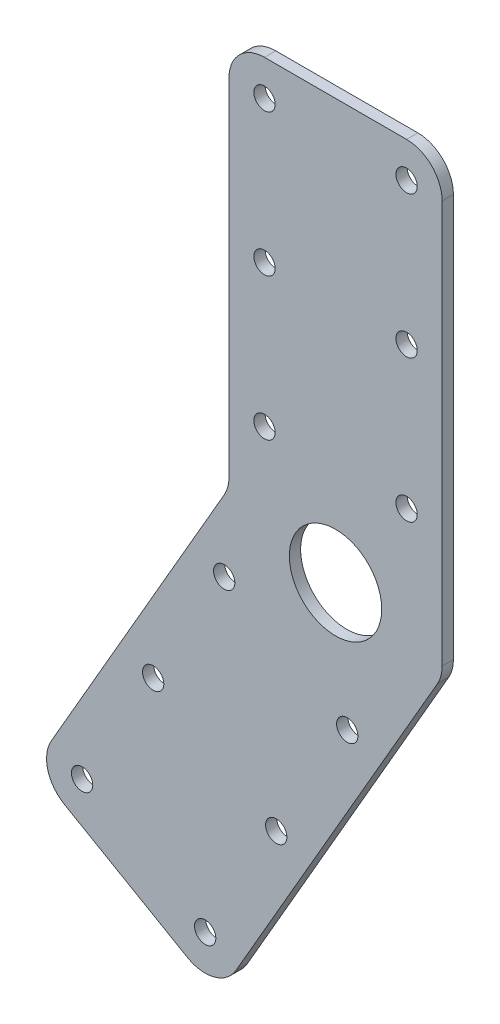
ISO-10303-21;
HEADER;
FILE_DESCRIPTION(('STEP AP214'),'2;1');
FILE_NAME('part.step','',(''),(''),'','','');
FILE_SCHEMA(('AUTOMOTIVE_DESIGN { 1 0 10303 214 1 1 1 1 }'));
ENDSEC;
DATA;
#1=APPLICATION_CONTEXT('core data for automotive mechanical design processes');
#2=APPLICATION_PROTOCOL_DEFINITION('international standard','automotive_design',2000,#1);
#3=PRODUCT_CONTEXT('',#1,'mechanical');
#4=PRODUCT('Part','Part','',(#3));
#5=PRODUCT_RELATED_PRODUCT_CATEGORY('part','',(#4));
#6=PRODUCT_DEFINITION_FORMATION('','',#4);
#7=PRODUCT_DEFINITION_CONTEXT('part definition',#1,'design');
#8=PRODUCT_DEFINITION('design','',#6,#7);
#9=PRODUCT_DEFINITION_SHAPE('','',#8);
#10=(LENGTH_UNIT() NAMED_UNIT(*) SI_UNIT(.MILLI.,.METRE.));
#11=(NAMED_UNIT(*) PLANE_ANGLE_UNIT() SI_UNIT($,.RADIAN.));
#12=(NAMED_UNIT(*) SI_UNIT($,.STERADIAN.) SOLID_ANGLE_UNIT());
#13=UNCERTAINTY_MEASURE_WITH_UNIT(LENGTH_MEASURE(1.E-05),#10,'distance_accuracy_value','');
#14=(GEOMETRIC_REPRESENTATION_CONTEXT(3) GLOBAL_UNCERTAINTY_ASSIGNED_CONTEXT((#13)) GLOBAL_UNIT_ASSIGNED_CONTEXT((#10,
#11,#12)) REPRESENTATION_CONTEXT('',''));
#15=CARTESIAN_POINT('',(0.,0.,0.));
#16=DIRECTION('',(0.,0.,1.));
#17=DIRECTION('',(1.,0.,0.));
#18=AXIS2_PLACEMENT_3D('',#15,#16,#17);
#19=CARTESIAN_POINT('',(0.,0.,1.5875));
#20=DIRECTION('',(0.,0.,1.));
#21=DIRECTION('',(1.,0.,0.));
#22=AXIS2_PLACEMENT_3D('',#19,#20,#21);
#23=PLANE('',#22);
#24=CARTESIAN_POINT('',(6.65063509461085,-38.4807621135331,1.5875));
#25=DIRECTION('',(0.,0.,1.));
#26=DIRECTION('',(-1.,0.,0.));
#27=AXIS2_PLACEMENT_3D('',#24,#25,#26);
#28=CIRCLE('',#27,1.5);
#29=CARTESIAN_POINT('',(5.15063509461085,-38.4807621135331,1.5875));
#30=VERTEX_POINT('',#29);
#31=EDGE_CURVE('E618',#30,#30,#28,.T.);
#32=ORIENTED_EDGE('',*,*,#31,.F.);
#33=EDGE_LOOP('',(#32));
#34=FACE_BOUND('',#33,.T.);
#35=CARTESIAN_POINT('',(-0.669872981077804,-11.1602540378444,1.5875));
#36=DIRECTION('',(0.,0.,1.));
#37=DIRECTION('',(1.,0.,0.));
#38=AXIS2_PLACEMENT_3D('',#35,#36,#37);
#39=CIRCLE('',#38,1.5);
#40=CARTESIAN_POINT('',(0.830127018922197,-11.1602540378444,1.5875));
#41=VERTEX_POINT('',#40);
#42=EDGE_CURVE('E602',#41,#41,#39,.T.);
#43=ORIENTED_EDGE('',*,*,#42,.F.);
#44=EDGE_LOOP('',(#43));
#45=FACE_BOUND('',#44,.T.);
#46=CARTESIAN_POINT('',(-20.6698729810778,-45.8012701892219,1.5875));
#47=DIRECTION('',(0.,0.,1.));
#48=DIRECTION('',(1.,0.,0.));
#49=AXIS2_PLACEMENT_3D('',#46,#47,#48);
#50=CIRCLE('',#49,1.5);
#51=CARTESIAN_POINT('',(-19.1698729810778,-45.8012701892219,1.5875));
#52=VERTEX_POINT('',#51);
#53=EDGE_CURVE('E586',#52,#52,#50,.T.);
#54=ORIENTED_EDGE('',*,*,#53,.F.);
#55=EDGE_LOOP('',(#54));
#56=FACE_BOUND('',#55,.T.);
#57=CARTESIAN_POINT('',(25.,30.,1.5875));
#58=DIRECTION('',(0.,0.,1.));
#59=DIRECTION('',(-1.,0.,0.));
#60=AXIS2_PLACEMENT_3D('',#57,#58,#59);
#61=CIRCLE('',#60,1.5);
#62=CARTESIAN_POINT('',(23.5,30.,1.5875));
#63=VERTEX_POINT('',#62);
#64=EDGE_CURVE('E570',#63,#63,#61,.T.);
#65=ORIENTED_EDGE('',*,*,#64,.F.);
#66=EDGE_LOOP('',(#65));
#67=FACE_BOUND('',#66,.T.);
#68=CARTESIAN_POINT('',(5.00000000000001,10.,1.5875));
#69=DIRECTION('',(0.,0.,1.));
#70=DIRECTION('',(1.,0.,0.));
#71=AXIS2_PLACEMENT_3D('',#68,#69,#70);
#72=CIRCLE('',#71,1.5);
#73=CARTESIAN_POINT('',(6.50000000000001,10.,1.5875));
#74=VERTEX_POINT('',#73);
#75=EDGE_CURVE('E554',#74,#74,#72,.T.);
#76=ORIENTED_EDGE('',*,*,#75,.F.);
#77=EDGE_LOOP('',(#76));
#78=FACE_BOUND('',#77,.T.);
#79=CARTESIAN_POINT('',(5.,50.,1.5875));
#80=DIRECTION('',(0.,0.,1.));
#81=DIRECTION('',(1.,0.,0.));
#82=AXIS2_PLACEMENT_3D('',#79,#80,#81);
#83=CIRCLE('',#82,1.5);
#84=CARTESIAN_POINT('',(6.5,50.,1.5875));
#85=VERTEX_POINT('',#84);
#86=EDGE_CURVE('E538',#85,#85,#83,.T.);
#87=ORIENTED_EDGE('',*,*,#86,.F.);
#88=EDGE_LOOP('',(#87));
#89=FACE_BOUND('',#88,.T.);
#90=DIRECTION('',(0.500000000000001,0.866025403784438,0.));
#91=VECTOR('',#90,1.);
#92=CARTESIAN_POINT('',(30.,-8.0384757729337,1.5875));
#93=LINE('',#92,#91);
#94=CARTESIAN_POINT('',(0.980762113533092,-58.3012701892219,1.5875));
#95=VERTEX_POINT('',#94);
#96=CARTESIAN_POINT('',(29.3301270189222,-9.19872981077808,1.5875));
#97=VERTEX_POINT('',#96);
#98=EDGE_CURVE('E257',#95,#97,#93,.T.);
#99=ORIENTED_EDGE('',*,*,#98,.T.);
#100=CARTESIAN_POINT('',(25.,-6.69872981077808,1.5875));
#101=DIRECTION('',(0.,0.,1.));
#102=DIRECTION('',(1.,0.,0.));
#103=AXIS2_PLACEMENT_3D('',#100,#101,#102);
#104=CIRCLE('',#103,5.);
#105=CARTESIAN_POINT('',(30.,-6.69872981077808,1.5875));
#106=VERTEX_POINT('',#105);
#107=EDGE_CURVE('E204',#97,#106,#104,.T.);
#108=ORIENTED_EDGE('',*,*,#107,.T.);
#109=DIRECTION('',(0.,1.,0.));
#110=VECTOR('',#109,1.);
#111=CARTESIAN_POINT('',(30.,55.,1.5875));
#112=LINE('',#111,#110);
#113=CARTESIAN_POINT('',(30.,50.,1.5875));
#114=VERTEX_POINT('',#113);
#115=EDGE_CURVE('E151',#106,#114,#112,.T.);
#116=ORIENTED_EDGE('',*,*,#115,.T.);
#117=CARTESIAN_POINT('',(25.,50.,1.5875));
#118=DIRECTION('',(0.,0.,1.));
#119=DIRECTION('',(1.,0.,0.));
#120=AXIS2_PLACEMENT_3D('',#117,#118,#119);
#121=CIRCLE('',#120,5.);
#122=CARTESIAN_POINT('',(25.,55.,1.5875));
#123=VERTEX_POINT('',#122);
#124=EDGE_CURVE('E193',#114,#123,#121,.T.);
#125=ORIENTED_EDGE('',*,*,#124,.T.);
#126=DIRECTION('',(-1.,0.,0.));
#127=VECTOR('',#126,1.);
#128=CARTESIAN_POINT('',(0.,55.,1.5875));
#129=LINE('',#128,#127);
#130=CARTESIAN_POINT('',(5.,55.,1.5875));
#131=VERTEX_POINT('',#130);
#132=EDGE_CURVE('E267',#123,#131,#129,.T.);
#133=ORIENTED_EDGE('',*,*,#132,.T.);
#134=CARTESIAN_POINT('',(5.,50.,1.5875));
#135=DIRECTION('',(0.,0.,1.));
#136=DIRECTION('',(1.,0.,0.));
#137=AXIS2_PLACEMENT_3D('',#134,#135,#136);
#138=CIRCLE('',#137,5.);
#139=CARTESIAN_POINT('',(0.,50.,1.5875));
#140=VERTEX_POINT('',#139);
#141=EDGE_CURVE('E62',#131,#140,#138,.T.);
#142=ORIENTED_EDGE('',*,*,#141,.T.);
#143=DIRECTION('',(0.,-1.,0.));
#144=VECTOR('',#143,1.);
#145=CARTESIAN_POINT('',(0.,0.,1.5875));
#146=LINE('',#145,#144);
#147=CARTESIAN_POINT('',(0.,1.33974596215562,1.5875));
#148=VERTEX_POINT('',#147);
#149=EDGE_CURVE('E176',#140,#148,#146,.T.);
#150=ORIENTED_EDGE('',*,*,#149,.T.);
#151=CARTESIAN_POINT('',(-5.,1.33974596215562,1.5875));
#152=DIRECTION('',(0.,0.,1.));
#153=DIRECTION('',(1.,0.,0.));
#154=AXIS2_PLACEMENT_3D('',#151,#152,#153);
#155=CIRCLE('',#154,5.);
#156=CARTESIAN_POINT('',(-0.669872981077797,-1.16025403784437,1.5875));
#157=VERTEX_POINT('',#156);
#158=EDGE_CURVE('E11',#148,#157,#155,.F.);
#159=ORIENTED_EDGE('',*,*,#158,.T.);
#160=DIRECTION('',(-0.500000000000001,-0.866025403784438,0.));
#161=VECTOR('',#160,1.);
#162=CARTESIAN_POINT('',(-27.5000000000001,-47.6313972081441,1.5875));
#163=LINE('',#162,#161);
#164=CARTESIAN_POINT('',(-25.,-43.3012701892219,1.5875));
#165=VERTEX_POINT('',#164);
#166=EDGE_CURVE('E174',#157,#165,#163,.T.);
#167=ORIENTED_EDGE('',*,*,#166,.T.);
#168=CARTESIAN_POINT('',(-20.6698729810779,-45.8012701892219,1.5875));
#169=DIRECTION('',(0.,0.,1.));
#170=DIRECTION('',(1.,0.,0.));
#171=AXIS2_PLACEMENT_3D('',#168,#169,#170);
#172=CIRCLE('',#171,5.);
#173=CARTESIAN_POINT('',(-23.1698729810779,-50.1313972081441,1.5875));
#174=VERTEX_POINT('',#173);
#175=EDGE_CURVE('E198',#165,#174,#172,.T.);
#176=ORIENTED_EDGE('',*,*,#175,.T.);
#177=DIRECTION('',(0.866025403784438,-0.500000000000001,0.));
#178=VECTOR('',#177,1.);
#179=CARTESIAN_POINT('',(-1.51923788646692,-62.6313972081441,1.5875));
#180=LINE('',#179,#178);
#181=CARTESIAN_POINT('',(-5.8493649053891,-60.1313972081441,1.5875));
#182=VERTEX_POINT('',#181);
#183=EDGE_CURVE('E253',#174,#182,#180,.T.);
#184=ORIENTED_EDGE('',*,*,#183,.T.);
#185=CARTESIAN_POINT('',(-3.3493649053891,-55.8012701892219,1.5875));
#186=DIRECTION('',(0.,0.,1.));
#187=DIRECTION('',(1.,0.,0.));
#188=AXIS2_PLACEMENT_3D('',#185,#186,#187);
#189=CIRCLE('',#188,5.);
#190=EDGE_CURVE('E201',#182,#95,#189,.T.);
#191=ORIENTED_EDGE('',*,*,#190,.T.);
#192=EDGE_LOOP('',(#99,#108,#116,#125,#133,#142,#150,#159,#167,#176,#184,#191));
#193=FACE_BOUND('',#192,.T.);
#194=CARTESIAN_POINT('',(15.,-4.01923788646685,1.5875));
#195=DIRECTION('',(0.,0.,1.));
#196=DIRECTION('',(1.,0.,0.));
#197=AXIS2_PLACEMENT_3D('',#194,#195,#196);
#198=CIRCLE('',#197,6.5);
#199=CARTESIAN_POINT('',(21.5,-4.01923788646685,1.5875));
#200=VERTEX_POINT('',#199);
#201=EDGE_CURVE('E273',#200,#200,#198,.T.);
#202=ORIENTED_EDGE('',*,*,#201,.F.);
#203=EDGE_LOOP('',(#202));
#204=FACE_BOUND('',#203,.T.);
#205=CARTESIAN_POINT('',(5.,30.,1.5875));
#206=DIRECTION('',(0.,0.,1.));
#207=DIRECTION('',(1.,0.,0.));
#208=AXIS2_PLACEMENT_3D('',#205,#206,#207);
#209=CIRCLE('',#208,1.5);
#210=CARTESIAN_POINT('',(6.5,30.,1.5875));
#211=VERTEX_POINT('',#210);
#212=EDGE_CURVE('E547',#211,#211,#209,.T.);
#213=ORIENTED_EDGE('',*,*,#212,.F.);
#214=EDGE_LOOP('',(#213));
#215=FACE_BOUND('',#214,.T.);
#216=CARTESIAN_POINT('',(25.,10.,1.5875));
#217=DIRECTION('',(0.,0.,1.));
#218=DIRECTION('',(-1.,0.,0.));
#219=AXIS2_PLACEMENT_3D('',#216,#217,#218);
#220=CIRCLE('',#219,1.5);
#221=CARTESIAN_POINT('',(23.5,10.,1.5875));
#222=VERTEX_POINT('',#221);
#223=EDGE_CURVE('E562',#222,#222,#220,.T.);
#224=ORIENTED_EDGE('',*,*,#223,.F.);
#225=EDGE_LOOP('',(#224));
#226=FACE_BOUND('',#225,.T.);
#227=CARTESIAN_POINT('',(25.,50.,1.5875));
#228=DIRECTION('',(0.,0.,1.));
#229=DIRECTION('',(-1.,0.,0.));
#230=AXIS2_PLACEMENT_3D('',#227,#228,#229);
#231=CIRCLE('',#230,1.5);
#232=CARTESIAN_POINT('',(23.5,50.,1.5875));
#233=VERTEX_POINT('',#232);
#234=EDGE_CURVE('E578',#233,#233,#231,.T.);
#235=ORIENTED_EDGE('',*,*,#234,.F.);
#236=EDGE_LOOP('',(#235));
#237=FACE_BOUND('',#236,.T.);
#238=CARTESIAN_POINT('',(-10.6698729810778,-28.4807621135332,1.5875));
#239=DIRECTION('',(0.,0.,1.));
#240=DIRECTION('',(1.,0.,0.));
#241=AXIS2_PLACEMENT_3D('',#238,#239,#240);
#242=CIRCLE('',#241,1.5);
#243=CARTESIAN_POINT('',(-9.1698729810778,-28.4807621135332,1.5875));
#244=VERTEX_POINT('',#243);
#245=EDGE_CURVE('E594',#244,#244,#242,.T.);
#246=ORIENTED_EDGE('',*,*,#245,.F.);
#247=EDGE_LOOP('',(#246));
#248=FACE_BOUND('',#247,.T.);
#249=CARTESIAN_POINT('',(16.6506350946109,-21.1602540378443,1.5875));
#250=DIRECTION('',(0.,0.,1.));
#251=DIRECTION('',(-1.,0.,0.));
#252=AXIS2_PLACEMENT_3D('',#249,#250,#251);
#253=CIRCLE('',#252,1.5);
#254=CARTESIAN_POINT('',(15.1506350946109,-21.1602540378443,1.5875));
#255=VERTEX_POINT('',#254);
#256=EDGE_CURVE('E610',#255,#255,#253,.T.);
#257=ORIENTED_EDGE('',*,*,#256,.F.);
#258=EDGE_LOOP('',(#257));
#259=FACE_BOUND('',#258,.T.);
#260=CARTESIAN_POINT('',(-3.34936490538915,-55.8012701892219,1.5875));
#261=DIRECTION('',(0.,0.,1.));
#262=DIRECTION('',(-1.,0.,0.));
#263=AXIS2_PLACEMENT_3D('',#260,#261,#262);
#264=CIRCLE('',#263,1.5);
#265=CARTESIAN_POINT('',(-4.84936490538915,-55.8012701892219,1.5875));
#266=VERTEX_POINT('',#265);
#267=EDGE_CURVE('E626',#266,#266,#264,.T.);
#268=ORIENTED_EDGE('',*,*,#267,.F.);
#269=EDGE_LOOP('',(#268));
#270=FACE_BOUND('',#269,.T.);
#271=ADVANCED_FACE('F39',(#34,#45,#56,#67,#78,#89,#193,#204,#215,#226,#237,#248,#259,#270),#23,.T.);
#272=CARTESIAN_POINT('',(0.,0.,0.));
#273=DIRECTION('',(0.,0.,1.));
#274=DIRECTION('',(1.,0.,0.));
#275=AXIS2_PLACEMENT_3D('',#272,#273,#274);
#276=PLANE('',#275);
#277=DIRECTION('',(0.,1.,0.));
#278=VECTOR('',#277,1.);
#279=CARTESIAN_POINT('',(30.,55.,0.));
#280=LINE('',#279,#278);
#281=CARTESIAN_POINT('',(30.,-6.69872981077808,0.));
#282=VERTEX_POINT('',#281);
#283=CARTESIAN_POINT('',(30.,50.,0.));
#284=VERTEX_POINT('',#283);
#285=EDGE_CURVE('E148',#282,#284,#280,.T.);
#286=ORIENTED_EDGE('',*,*,#285,.F.);
#287=CARTESIAN_POINT('',(25.,-6.69872981077808,0.));
#288=DIRECTION('',(0.,0.,1.));
#289=DIRECTION('',(1.,0.,0.));
#290=AXIS2_PLACEMENT_3D('',#287,#288,#289);
#291=CIRCLE('',#290,5.);
#292=CARTESIAN_POINT('',(29.3301270189222,-9.19872981077808,0.));
#293=VERTEX_POINT('',#292);
#294=EDGE_CURVE('E130',#282,#293,#291,.F.);
#295=ORIENTED_EDGE('',*,*,#294,.T.);
#296=DIRECTION('',(0.500000000000001,0.866025403784438,0.));
#297=VECTOR('',#296,1.);
#298=CARTESIAN_POINT('',(30.,-8.0384757729337,0.));
#299=LINE('',#298,#297);
#300=CARTESIAN_POINT('',(0.980762113533092,-58.3012701892219,0.));
#301=VERTEX_POINT('',#300);
#302=EDGE_CURVE('E161',#301,#293,#299,.T.);
#303=ORIENTED_EDGE('',*,*,#302,.F.);
#304=CARTESIAN_POINT('',(-3.3493649053891,-55.8012701892219,0.));
#305=DIRECTION('',(0.,0.,1.));
#306=DIRECTION('',(1.,0.,0.));
#307=AXIS2_PLACEMENT_3D('',#304,#305,#306);
#308=CIRCLE('',#307,5.);
#309=CARTESIAN_POINT('',(-5.8493649053891,-60.1313972081441,0.));
#310=VERTEX_POINT('',#309);
#311=EDGE_CURVE('E142',#301,#310,#308,.F.);
#312=ORIENTED_EDGE('',*,*,#311,.T.);
#313=DIRECTION('',(0.866025403784438,-0.500000000000001,0.));
#314=VECTOR('',#313,1.);
#315=CARTESIAN_POINT('',(-1.51923788646692,-62.6313972081441,0.));
#316=LINE('',#315,#314);
#317=CARTESIAN_POINT('',(-23.1698729810779,-50.1313972081441,0.));
#318=VERTEX_POINT('',#317);
#319=EDGE_CURVE('E168',#318,#310,#316,.T.);
#320=ORIENTED_EDGE('',*,*,#319,.F.);
#321=CARTESIAN_POINT('',(-20.6698729810779,-45.8012701892219,0.));
#322=DIRECTION('',(0.,0.,1.));
#323=DIRECTION('',(1.,0.,0.));
#324=AXIS2_PLACEMENT_3D('',#321,#322,#323);
#325=CIRCLE('',#324,5.);
#326=CARTESIAN_POINT('',(-25.,-43.3012701892219,0.));
#327=VERTEX_POINT('',#326);
#328=EDGE_CURVE('E183',#318,#327,#325,.F.);
#329=ORIENTED_EDGE('',*,*,#328,.T.);
#330=DIRECTION('',(-0.500000000000001,-0.866025403784438,0.));
#331=VECTOR('',#330,1.);
#332=CARTESIAN_POINT('',(-27.5000000000001,-47.6313972081441,0.));
#333=LINE('',#332,#331);
#334=CARTESIAN_POINT('',(-0.669872981077797,-1.16025403784437,0.));
#335=VERTEX_POINT('',#334);
#336=EDGE_CURVE('E237',#335,#327,#333,.T.);
#337=ORIENTED_EDGE('',*,*,#336,.F.);
#338=CARTESIAN_POINT('',(-5.,1.33974596215562,0.));
#339=DIRECTION('',(0.,0.,1.));
#340=DIRECTION('',(1.,0.,0.));
#341=AXIS2_PLACEMENT_3D('',#338,#339,#340);
#342=CIRCLE('',#341,5.);
#343=CARTESIAN_POINT('',(0.,1.33974596215562,0.));
#344=VERTEX_POINT('',#343);
#345=EDGE_CURVE('E48',#335,#344,#342,.T.);
#346=ORIENTED_EDGE('',*,*,#345,.T.);
#347=DIRECTION('',(0.,-1.,0.));
#348=VECTOR('',#347,1.);
#349=CARTESIAN_POINT('',(0.,0.,0.));
#350=LINE('',#349,#348);
#351=CARTESIAN_POINT('',(0.,50.,0.));
#352=VERTEX_POINT('',#351);
#353=EDGE_CURVE('E166',#352,#344,#350,.T.);
#354=ORIENTED_EDGE('',*,*,#353,.F.);
#355=CARTESIAN_POINT('',(5.,50.,0.));
#356=DIRECTION('',(0.,0.,1.));
#357=DIRECTION('',(1.,0.,0.));
#358=AXIS2_PLACEMENT_3D('',#355,#356,#357);
#359=CIRCLE('',#358,5.);
#360=CARTESIAN_POINT('',(5.,55.,0.));
#361=VERTEX_POINT('',#360);
#362=EDGE_CURVE('E180',#352,#361,#359,.F.);
#363=ORIENTED_EDGE('',*,*,#362,.T.);
#364=DIRECTION('',(-1.,0.,0.));
#365=VECTOR('',#364,1.);
#366=CARTESIAN_POINT('',(0.,55.,0.));
#367=LINE('',#366,#365);
#368=CARTESIAN_POINT('',(25.,55.,0.));
#369=VERTEX_POINT('',#368);
#370=EDGE_CURVE('E160',#369,#361,#367,.T.);
#371=ORIENTED_EDGE('',*,*,#370,.F.);
#372=CARTESIAN_POINT('',(25.,50.,0.));
#373=DIRECTION('',(0.,0.,1.));
#374=DIRECTION('',(1.,0.,0.));
#375=AXIS2_PLACEMENT_3D('',#372,#373,#374);
#376=CIRCLE('',#375,5.);
#377=EDGE_CURVE('E153',#369,#284,#376,.F.);
#378=ORIENTED_EDGE('',*,*,#377,.T.);
#379=EDGE_LOOP('',(#286,#295,#303,#312,#320,#329,#337,#346,#354,#363,#371,#378));
#380=FACE_BOUND('',#379,.T.);
#381=CARTESIAN_POINT('',(15.,-4.01923788646685,0.));
#382=DIRECTION('',(0.,0.,1.));
#383=DIRECTION('',(1.,0.,0.));
#384=AXIS2_PLACEMENT_3D('',#381,#382,#383);
#385=CIRCLE('',#384,6.5);
#386=CARTESIAN_POINT('',(21.5,-4.01923788646685,0.));
#387=VERTEX_POINT('',#386);
#388=EDGE_CURVE('E260',#387,#387,#385,.T.);
#389=ORIENTED_EDGE('',*,*,#388,.T.);
#390=EDGE_LOOP('',(#389));
#391=FACE_BOUND('',#390,.T.);
#392=CARTESIAN_POINT('',(5.,50.,0.));
#393=DIRECTION('',(0.,0.,1.));
#394=DIRECTION('',(1.,0.,0.));
#395=AXIS2_PLACEMENT_3D('',#392,#393,#394);
#396=CIRCLE('',#395,1.5);
#397=CARTESIAN_POINT('',(6.5,50.,0.));
#398=VERTEX_POINT('',#397);
#399=EDGE_CURVE('E542',#398,#398,#396,.T.);
#400=ORIENTED_EDGE('',*,*,#399,.T.);
#401=EDGE_LOOP('',(#400));
#402=FACE_BOUND('',#401,.T.);
#403=CARTESIAN_POINT('',(5.,30.,0.));
#404=DIRECTION('',(0.,0.,1.));
#405=DIRECTION('',(1.,0.,0.));
#406=AXIS2_PLACEMENT_3D('',#403,#404,#405);
#407=CIRCLE('',#406,1.5);
#408=CARTESIAN_POINT('',(6.5,30.,0.));
#409=VERTEX_POINT('',#408);
#410=EDGE_CURVE('E550',#409,#409,#407,.T.);
#411=ORIENTED_EDGE('',*,*,#410,.T.);
#412=EDGE_LOOP('',(#411));
#413=FACE_BOUND('',#412,.T.);
#414=CARTESIAN_POINT('',(5.00000000000001,10.,0.));
#415=DIRECTION('',(0.,0.,1.));
#416=DIRECTION('',(1.,0.,0.));
#417=AXIS2_PLACEMENT_3D('',#414,#415,#416);
#418=CIRCLE('',#417,1.5);
#419=CARTESIAN_POINT('',(6.50000000000001,10.,0.));
#420=VERTEX_POINT('',#419);
#421=EDGE_CURVE('E558',#420,#420,#418,.T.);
#422=ORIENTED_EDGE('',*,*,#421,.T.);
#423=EDGE_LOOP('',(#422));
#424=FACE_BOUND('',#423,.T.);
#425=CARTESIAN_POINT('',(25.,10.,0.));
#426=DIRECTION('',(0.,0.,1.));
#427=DIRECTION('',(-1.,0.,0.));
#428=AXIS2_PLACEMENT_3D('',#425,#426,#427);
#429=CIRCLE('',#428,1.5);
#430=CARTESIAN_POINT('',(23.5,10.,0.));
#431=VERTEX_POINT('',#430);
#432=EDGE_CURVE('E566',#431,#431,#429,.T.);
#433=ORIENTED_EDGE('',*,*,#432,.T.);
#434=EDGE_LOOP('',(#433));
#435=FACE_BOUND('',#434,.T.);
#436=CARTESIAN_POINT('',(25.,30.,0.));
#437=DIRECTION('',(0.,0.,1.));
#438=DIRECTION('',(-1.,0.,0.));
#439=AXIS2_PLACEMENT_3D('',#436,#437,#438);
#440=CIRCLE('',#439,1.5);
#441=CARTESIAN_POINT('',(23.5,30.,0.));
#442=VERTEX_POINT('',#441);
#443=EDGE_CURVE('E574',#442,#442,#440,.T.);
#444=ORIENTED_EDGE('',*,*,#443,.T.);
#445=EDGE_LOOP('',(#444));
#446=FACE_BOUND('',#445,.T.);
#447=CARTESIAN_POINT('',(25.,50.,0.));
#448=DIRECTION('',(0.,0.,1.));
#449=DIRECTION('',(-1.,0.,0.));
#450=AXIS2_PLACEMENT_3D('',#447,#448,#449);
#451=CIRCLE('',#450,1.5);
#452=CARTESIAN_POINT('',(23.5,50.,0.));
#453=VERTEX_POINT('',#452);
#454=EDGE_CURVE('E582',#453,#453,#451,.T.);
#455=ORIENTED_EDGE('',*,*,#454,.T.);
#456=EDGE_LOOP('',(#455));
#457=FACE_BOUND('',#456,.T.);
#458=CARTESIAN_POINT('',(-20.6698729810778,-45.8012701892219,0.));
#459=DIRECTION('',(0.,0.,1.));
#460=DIRECTION('',(1.,0.,0.));
#461=AXIS2_PLACEMENT_3D('',#458,#459,#460);
#462=CIRCLE('',#461,1.5);
#463=CARTESIAN_POINT('',(-19.1698729810778,-45.8012701892219,0.));
#464=VERTEX_POINT('',#463);
#465=EDGE_CURVE('E590',#464,#464,#462,.T.);
#466=ORIENTED_EDGE('',*,*,#465,.T.);
#467=EDGE_LOOP('',(#466));
#468=FACE_BOUND('',#467,.T.);
#469=CARTESIAN_POINT('',(-10.6698729810778,-28.4807621135332,0.));
#470=DIRECTION('',(0.,0.,1.));
#471=DIRECTION('',(1.,0.,0.));
#472=AXIS2_PLACEMENT_3D('',#469,#470,#471);
#473=CIRCLE('',#472,1.5);
#474=CARTESIAN_POINT('',(-9.1698729810778,-28.4807621135332,0.));
#475=VERTEX_POINT('',#474);
#476=EDGE_CURVE('E598',#475,#475,#473,.T.);
#477=ORIENTED_EDGE('',*,*,#476,.T.);
#478=EDGE_LOOP('',(#477));
#479=FACE_BOUND('',#478,.T.);
#480=CARTESIAN_POINT('',(-0.669872981077804,-11.1602540378444,0.));
#481=DIRECTION('',(0.,0.,1.));
#482=DIRECTION('',(1.,0.,0.));
#483=AXIS2_PLACEMENT_3D('',#480,#481,#482);
#484=CIRCLE('',#483,1.5);
#485=CARTESIAN_POINT('',(0.830127018922197,-11.1602540378444,0.));
#486=VERTEX_POINT('',#485);
#487=EDGE_CURVE('E606',#486,#486,#484,.T.);
#488=ORIENTED_EDGE('',*,*,#487,.T.);
#489=EDGE_LOOP('',(#488));
#490=FACE_BOUND('',#489,.T.);
#491=CARTESIAN_POINT('',(16.6506350946109,-21.1602540378443,0.));
#492=DIRECTION('',(0.,0.,1.));
#493=DIRECTION('',(-1.,0.,0.));
#494=AXIS2_PLACEMENT_3D('',#491,#492,#493);
#495=CIRCLE('',#494,1.5);
#496=CARTESIAN_POINT('',(15.1506350946109,-21.1602540378443,0.));
#497=VERTEX_POINT('',#496);
#498=EDGE_CURVE('E614',#497,#497,#495,.T.);
#499=ORIENTED_EDGE('',*,*,#498,.T.);
#500=EDGE_LOOP('',(#499));
#501=FACE_BOUND('',#500,.T.);
#502=CARTESIAN_POINT('',(6.65063509461085,-38.4807621135331,0.));
#503=DIRECTION('',(0.,0.,1.));
#504=DIRECTION('',(-1.,0.,0.));
#505=AXIS2_PLACEMENT_3D('',#502,#503,#504);
#506=CIRCLE('',#505,1.5);
#507=CARTESIAN_POINT('',(5.15063509461085,-38.4807621135331,0.));
#508=VERTEX_POINT('',#507);
#509=EDGE_CURVE('E622',#508,#508,#506,.T.);
#510=ORIENTED_EDGE('',*,*,#509,.T.);
#511=EDGE_LOOP('',(#510));
#512=FACE_BOUND('',#511,.T.);
#513=CARTESIAN_POINT('',(-3.34936490538915,-55.8012701892219,0.));
#514=DIRECTION('',(0.,0.,1.));
#515=DIRECTION('',(-1.,0.,0.));
#516=AXIS2_PLACEMENT_3D('',#513,#514,#515);
#517=CIRCLE('',#516,1.5);
#518=CARTESIAN_POINT('',(-4.84936490538915,-55.8012701892219,0.));
#519=VERTEX_POINT('',#518);
#520=EDGE_CURVE('E630',#519,#519,#517,.T.);
#521=ORIENTED_EDGE('',*,*,#520,.T.);
#522=EDGE_LOOP('',(#521));
#523=FACE_BOUND('',#522,.T.);
#524=ADVANCED_FACE('F156',(#380,#391,#402,#413,#424,#435,#446,#457,#468,#479,#490,#501,#512,
#523),#276,.F.);
#525=CARTESIAN_POINT('',(-27.5000000000001,-47.6313972081441,1.5875));
#526=DIRECTION('',(0.866025403784438,-0.500000000000001,0.));
#527=DIRECTION('',(0.500000000000001,0.866025403784438,0.));
#528=AXIS2_PLACEMENT_3D('',#525,#526,#527);
#529=PLANE('',#528);
#530=ORIENTED_EDGE('',*,*,#166,.F.);
#531=DIRECTION('',(0.,0.,-1.));
#532=VECTOR('',#531,1.);
#533=CARTESIAN_POINT('',(-0.669872981077809,-1.16025403784439,0.));
#534=LINE('',#533,#532);
#535=EDGE_CURVE('E210',#157,#335,#534,.T.);
#536=ORIENTED_EDGE('',*,*,#535,.T.);
#537=ORIENTED_EDGE('',*,*,#336,.T.);
#538=DIRECTION('',(0.,0.,-1.));
#539=VECTOR('',#538,1.);
#540=CARTESIAN_POINT('',(-25.,-43.3012701892219,1.5875));
#541=LINE('',#540,#539);
#542=EDGE_CURVE('E207',#327,#165,#541,.F.);
#543=ORIENTED_EDGE('',*,*,#542,.T.);
#544=EDGE_LOOP('',(#530,#536,#537,#543));
#545=FACE_BOUND('',#544,.T.);
#546=ADVANCED_FACE('F250',(#545),#529,.F.);
#547=CARTESIAN_POINT('',(-1.51923788646692,-62.6313972081441,1.5875));
#548=DIRECTION('',(0.500000000000001,0.866025403784438,0.));
#549=DIRECTION('',(-0.866025403784438,0.500000000000001,0.));
#550=AXIS2_PLACEMENT_3D('',#547,#548,#549);
#551=PLANE('',#550);
#552=ORIENTED_EDGE('',*,*,#319,.T.);
#553=DIRECTION('',(0.,0.,-1.));
#554=VECTOR('',#553,1.);
#555=CARTESIAN_POINT('',(-5.8493649053891,-60.1313972081441,1.5875));
#556=LINE('',#555,#554);
#557=EDGE_CURVE('E224',#310,#182,#556,.F.);
#558=ORIENTED_EDGE('',*,*,#557,.T.);
#559=ORIENTED_EDGE('',*,*,#183,.F.);
#560=DIRECTION('',(0.,0.,-1.));
#561=VECTOR('',#560,1.);
#562=CARTESIAN_POINT('',(-23.1698729810779,-50.1313972081441,1.5875));
#563=LINE('',#562,#561);
#564=EDGE_CURVE('E220',#174,#318,#563,.T.);
#565=ORIENTED_EDGE('',*,*,#564,.T.);
#566=EDGE_LOOP('',(#552,#558,#559,#565));
#567=FACE_BOUND('',#566,.T.);
#568=ADVANCED_FACE('F279',(#567),#551,.F.);
#569=CARTESIAN_POINT('',(30.,-8.0384757729337,1.5875));
#570=DIRECTION('',(-0.866025403784438,0.500000000000001,0.));
#571=DIRECTION('',(-0.500000000000001,-0.866025403784438,0.));
#572=AXIS2_PLACEMENT_3D('',#569,#570,#571);
#573=PLANE('',#572);
#574=ORIENTED_EDGE('',*,*,#302,.T.);
#575=DIRECTION('',(0.,0.,-1.));
#576=VECTOR('',#575,1.);
#577=CARTESIAN_POINT('',(29.3301270189222,-9.19872981077808,1.5875));
#578=LINE('',#577,#576);
#579=EDGE_CURVE('E135',#293,#97,#578,.F.);
#580=ORIENTED_EDGE('',*,*,#579,.T.);
#581=ORIENTED_EDGE('',*,*,#98,.F.);
#582=DIRECTION('',(0.,0.,-1.));
#583=VECTOR('',#582,1.);
#584=CARTESIAN_POINT('',(0.980762113533092,-58.3012701892219,1.5875));
#585=LINE('',#584,#583);
#586=EDGE_CURVE('E141',#95,#301,#585,.T.);
#587=ORIENTED_EDGE('',*,*,#586,.T.);
#588=EDGE_LOOP('',(#574,#580,#581,#587));
#589=FACE_BOUND('',#588,.T.);
#590=ADVANCED_FACE('F288',(#589),#573,.F.);
#591=CARTESIAN_POINT('',(30.,55.,1.5875));
#592=DIRECTION('',(-1.,0.,0.));
#593=DIRECTION('',(0.,0.,1.));
#594=AXIS2_PLACEMENT_3D('',#591,#592,#593);
#595=PLANE('',#594);
#596=ORIENTED_EDGE('',*,*,#115,.F.);
#597=DIRECTION('',(0.,0.,-1.));
#598=VECTOR('',#597,1.);
#599=CARTESIAN_POINT('',(30.,-6.69872981077808,1.5875));
#600=LINE('',#599,#598);
#601=EDGE_CURVE('E134',#106,#282,#600,.T.);
#602=ORIENTED_EDGE('',*,*,#601,.T.);
#603=ORIENTED_EDGE('',*,*,#285,.T.);
#604=DIRECTION('',(0.,0.,-1.));
#605=VECTOR('',#604,1.);
#606=CARTESIAN_POINT('',(30.,50.,1.5875));
#607=LINE('',#606,#605);
#608=EDGE_CURVE('E154',#284,#114,#607,.F.);
#609=ORIENTED_EDGE('',*,*,#608,.T.);
#610=EDGE_LOOP('',(#596,#602,#603,#609));
#611=FACE_BOUND('',#610,.T.);
#612=ADVANCED_FACE('F147',(#611),#595,.F.);
#613=CARTESIAN_POINT('',(0.,55.,1.5875));
#614=DIRECTION('',(0.,-1.,0.));
#615=DIRECTION('',(0.,0.,-1.));
#616=AXIS2_PLACEMENT_3D('',#613,#614,#615);
#617=PLANE('',#616);
#618=ORIENTED_EDGE('',*,*,#370,.T.);
#619=DIRECTION('',(0.,0.,-1.));
#620=VECTOR('',#619,1.);
#621=CARTESIAN_POINT('',(5.,55.,1.5875));
#622=LINE('',#621,#620);
#623=EDGE_CURVE('E231',#361,#131,#622,.F.);
#624=ORIENTED_EDGE('',*,*,#623,.T.);
#625=ORIENTED_EDGE('',*,*,#132,.F.);
#626=DIRECTION('',(0.,0.,-1.));
#627=VECTOR('',#626,1.);
#628=CARTESIAN_POINT('',(25.,55.,1.5875));
#629=LINE('',#628,#627);
#630=EDGE_CURVE('E227',#123,#369,#629,.T.);
#631=ORIENTED_EDGE('',*,*,#630,.T.);
#632=EDGE_LOOP('',(#618,#624,#625,#631));
#633=FACE_BOUND('',#632,.T.);
#634=ADVANCED_FACE('F295',(#633),#617,.F.);
#635=CARTESIAN_POINT('',(0.,0.,1.5875));
#636=DIRECTION('',(1.,0.,0.));
#637=DIRECTION('',(0.,0.,-1.));
#638=AXIS2_PLACEMENT_3D('',#635,#636,#637);
#639=PLANE('',#638);
#640=ORIENTED_EDGE('',*,*,#353,.T.);
#641=DIRECTION('',(0.,0.,-1.));
#642=VECTOR('',#641,1.);
#643=CARTESIAN_POINT('',(0.,1.33974596215562,1.5875));
#644=LINE('',#643,#642);
#645=EDGE_CURVE('E55',#344,#148,#644,.F.);
#646=ORIENTED_EDGE('',*,*,#645,.T.);
#647=ORIENTED_EDGE('',*,*,#149,.F.);
#648=DIRECTION('',(0.,0.,-1.));
#649=VECTOR('',#648,1.);
#650=CARTESIAN_POINT('',(0.,50.,1.5875));
#651=LINE('',#650,#649);
#652=EDGE_CURVE('E214',#140,#352,#651,.T.);
#653=ORIENTED_EDGE('',*,*,#652,.T.);
#654=EDGE_LOOP('',(#640,#646,#647,#653));
#655=FACE_BOUND('',#654,.T.);
#656=ADVANCED_FACE('F240',(#655),#639,.F.);
#657=CARTESIAN_POINT('',(15.,-4.01923788646685,1.5875));
#658=DIRECTION('',(0.,0.,-1.));
#659=DIRECTION('',(-1.,0.,0.));
#660=AXIS2_PLACEMENT_3D('',#657,#658,#659);
#661=CYLINDRICAL_SURFACE('',#660,6.5);
#662=ORIENTED_EDGE('',*,*,#201,.T.);
#663=EDGE_LOOP('',(#662));
#664=FACE_BOUND('',#663,.T.);
#665=ORIENTED_EDGE('',*,*,#388,.F.);
#666=EDGE_LOOP('',(#665));
#667=FACE_BOUND('',#666,.T.);
#668=ADVANCED_FACE('F308',(#664,#667),#661,.F.);
#669=CARTESIAN_POINT('',(5.,50.,1.5875));
#670=DIRECTION('',(0.,0.,-1.));
#671=DIRECTION('',(-1.,0.,0.));
#672=AXIS2_PLACEMENT_3D('',#669,#670,#671);
#673=CYLINDRICAL_SURFACE('',#672,1.5);
#674=ORIENTED_EDGE('',*,*,#86,.T.);
#675=EDGE_LOOP('',(#674));
#676=FACE_BOUND('',#675,.T.);
#677=ORIENTED_EDGE('',*,*,#399,.F.);
#678=EDGE_LOOP('',(#677));
#679=FACE_BOUND('',#678,.T.);
#680=ADVANCED_FACE('F492',(#676,#679),#673,.F.);
#681=CARTESIAN_POINT('',(5.,30.,1.5875));
#682=DIRECTION('',(0.,0.,-1.));
#683=DIRECTION('',(-1.,0.,0.));
#684=AXIS2_PLACEMENT_3D('',#681,#682,#683);
#685=CYLINDRICAL_SURFACE('',#684,1.5);
#686=ORIENTED_EDGE('',*,*,#212,.T.);
#687=EDGE_LOOP('',(#686));
#688=FACE_BOUND('',#687,.T.);
#689=ORIENTED_EDGE('',*,*,#410,.F.);
#690=EDGE_LOOP('',(#689));
#691=FACE_BOUND('',#690,.T.);
#692=ADVANCED_FACE('F484',(#688,#691),#685,.F.);
#693=CARTESIAN_POINT('',(5.00000000000001,10.,1.5875));
#694=DIRECTION('',(0.,0.,-1.));
#695=DIRECTION('',(-1.,0.,0.));
#696=AXIS2_PLACEMENT_3D('',#693,#694,#695);
#697=CYLINDRICAL_SURFACE('',#696,1.5);
#698=ORIENTED_EDGE('',*,*,#75,.T.);
#699=EDGE_LOOP('',(#698));
#700=FACE_BOUND('',#699,.T.);
#701=ORIENTED_EDGE('',*,*,#421,.F.);
#702=EDGE_LOOP('',(#701));
#703=FACE_BOUND('',#702,.T.);
#704=ADVANCED_FACE('F476',(#700,#703),#697,.F.);
#705=CARTESIAN_POINT('',(25.,10.,1.5875));
#706=DIRECTION('',(0.,0.,-1.));
#707=DIRECTION('',(-1.,0.,0.));
#708=AXIS2_PLACEMENT_3D('',#705,#706,#707);
#709=CYLINDRICAL_SURFACE('',#708,1.5);
#710=ORIENTED_EDGE('',*,*,#223,.T.);
#711=EDGE_LOOP('',(#710));
#712=FACE_BOUND('',#711,.T.);
#713=ORIENTED_EDGE('',*,*,#432,.F.);
#714=EDGE_LOOP('',(#713));
#715=FACE_BOUND('',#714,.T.);
#716=ADVANCED_FACE('F468',(#712,#715),#709,.F.);
#717=CARTESIAN_POINT('',(25.,30.,1.5875));
#718=DIRECTION('',(0.,0.,-1.));
#719=DIRECTION('',(-1.,0.,0.));
#720=AXIS2_PLACEMENT_3D('',#717,#718,#719);
#721=CYLINDRICAL_SURFACE('',#720,1.5);
#722=ORIENTED_EDGE('',*,*,#64,.T.);
#723=EDGE_LOOP('',(#722));
#724=FACE_BOUND('',#723,.T.);
#725=ORIENTED_EDGE('',*,*,#443,.F.);
#726=EDGE_LOOP('',(#725));
#727=FACE_BOUND('',#726,.T.);
#728=ADVANCED_FACE('F460',(#724,#727),#721,.F.);
#729=CARTESIAN_POINT('',(25.,50.,1.5875));
#730=DIRECTION('',(0.,0.,-1.));
#731=DIRECTION('',(-1.,0.,0.));
#732=AXIS2_PLACEMENT_3D('',#729,#730,#731);
#733=CYLINDRICAL_SURFACE('',#732,1.5);
#734=ORIENTED_EDGE('',*,*,#234,.T.);
#735=EDGE_LOOP('',(#734));
#736=FACE_BOUND('',#735,.T.);
#737=ORIENTED_EDGE('',*,*,#454,.F.);
#738=EDGE_LOOP('',(#737));
#739=FACE_BOUND('',#738,.T.);
#740=ADVANCED_FACE('F452',(#736,#739),#733,.F.);
#741=CARTESIAN_POINT('',(-20.6698729810778,-45.8012701892219,1.5875));
#742=DIRECTION('',(0.,0.,-1.));
#743=DIRECTION('',(-1.,0.,0.));
#744=AXIS2_PLACEMENT_3D('',#741,#742,#743);
#745=CYLINDRICAL_SURFACE('',#744,1.5);
#746=ORIENTED_EDGE('',*,*,#53,.T.);
#747=EDGE_LOOP('',(#746));
#748=FACE_BOUND('',#747,.T.);
#749=ORIENTED_EDGE('',*,*,#465,.F.);
#750=EDGE_LOOP('',(#749));
#751=FACE_BOUND('',#750,.T.);
#752=ADVANCED_FACE('F444',(#748,#751),#745,.F.);
#753=CARTESIAN_POINT('',(-10.6698729810778,-28.4807621135332,1.5875));
#754=DIRECTION('',(0.,0.,-1.));
#755=DIRECTION('',(-1.,0.,0.));
#756=AXIS2_PLACEMENT_3D('',#753,#754,#755);
#757=CYLINDRICAL_SURFACE('',#756,1.5);
#758=ORIENTED_EDGE('',*,*,#245,.T.);
#759=EDGE_LOOP('',(#758));
#760=FACE_BOUND('',#759,.T.);
#761=ORIENTED_EDGE('',*,*,#476,.F.);
#762=EDGE_LOOP('',(#761));
#763=FACE_BOUND('',#762,.T.);
#764=ADVANCED_FACE('F436',(#760,#763),#757,.F.);
#765=CARTESIAN_POINT('',(-0.669872981077804,-11.1602540378444,1.5875));
#766=DIRECTION('',(0.,0.,-1.));
#767=DIRECTION('',(-1.,0.,0.));
#768=AXIS2_PLACEMENT_3D('',#765,#766,#767);
#769=CYLINDRICAL_SURFACE('',#768,1.5);
#770=ORIENTED_EDGE('',*,*,#42,.T.);
#771=EDGE_LOOP('',(#770));
#772=FACE_BOUND('',#771,.T.);
#773=ORIENTED_EDGE('',*,*,#487,.F.);
#774=EDGE_LOOP('',(#773));
#775=FACE_BOUND('',#774,.T.);
#776=ADVANCED_FACE('F428',(#772,#775),#769,.F.);
#777=CARTESIAN_POINT('',(16.6506350946109,-21.1602540378443,1.5875));
#778=DIRECTION('',(0.,0.,-1.));
#779=DIRECTION('',(-1.,0.,0.));
#780=AXIS2_PLACEMENT_3D('',#777,#778,#779);
#781=CYLINDRICAL_SURFACE('',#780,1.5);
#782=ORIENTED_EDGE('',*,*,#256,.T.);
#783=EDGE_LOOP('',(#782));
#784=FACE_BOUND('',#783,.T.);
#785=ORIENTED_EDGE('',*,*,#498,.F.);
#786=EDGE_LOOP('',(#785));
#787=FACE_BOUND('',#786,.T.);
#788=ADVANCED_FACE('F420',(#784,#787),#781,.F.);
#789=CARTESIAN_POINT('',(6.65063509461085,-38.4807621135331,1.5875));
#790=DIRECTION('',(0.,0.,-1.));
#791=DIRECTION('',(-1.,0.,0.));
#792=AXIS2_PLACEMENT_3D('',#789,#790,#791);
#793=CYLINDRICAL_SURFACE('',#792,1.5);
#794=ORIENTED_EDGE('',*,*,#31,.T.);
#795=EDGE_LOOP('',(#794));
#796=FACE_BOUND('',#795,.T.);
#797=ORIENTED_EDGE('',*,*,#509,.F.);
#798=EDGE_LOOP('',(#797));
#799=FACE_BOUND('',#798,.T.);
#800=ADVANCED_FACE('F413',(#796,#799),#793,.F.);
#801=CARTESIAN_POINT('',(-3.34936490538915,-55.8012701892219,1.5875));
#802=DIRECTION('',(0.,0.,-1.));
#803=DIRECTION('',(-1.,0.,0.));
#804=AXIS2_PLACEMENT_3D('',#801,#802,#803);
#805=CYLINDRICAL_SURFACE('',#804,1.5);
#806=ORIENTED_EDGE('',*,*,#267,.T.);
#807=EDGE_LOOP('',(#806));
#808=FACE_BOUND('',#807,.T.);
#809=ORIENTED_EDGE('',*,*,#520,.F.);
#810=EDGE_LOOP('',(#809));
#811=FACE_BOUND('',#810,.T.);
#812=ADVANCED_FACE('F338',(#808,#811),#805,.F.);
#813=CARTESIAN_POINT('',(25.,-6.69872981077808,1.5875));
#814=DIRECTION('',(0.,0.,-1.));
#815=DIRECTION('',(-1.,0.,0.));
#816=AXIS2_PLACEMENT_3D('',#813,#814,#815);
#817=CYLINDRICAL_SURFACE('',#816,5.);
#818=ORIENTED_EDGE('',*,*,#107,.F.);
#819=ORIENTED_EDGE('',*,*,#579,.F.);
#820=ORIENTED_EDGE('',*,*,#294,.F.);
#821=ORIENTED_EDGE('',*,*,#601,.F.);
#822=EDGE_LOOP('',(#818,#819,#820,#821));
#823=FACE_BOUND('',#822,.T.);
#824=ADVANCED_FACE('F133',(#823),#817,.T.);
#825=CARTESIAN_POINT('',(-5.,1.33974596215562,1.5875));
#826=DIRECTION('',(0.,0.,1.));
#827=DIRECTION('',(1.,0.,0.));
#828=AXIS2_PLACEMENT_3D('',#825,#826,#827);
#829=CYLINDRICAL_SURFACE('',#828,5.);
#830=ORIENTED_EDGE('',*,*,#158,.F.);
#831=ORIENTED_EDGE('',*,*,#645,.F.);
#832=ORIENTED_EDGE('',*,*,#345,.F.);
#833=ORIENTED_EDGE('',*,*,#535,.F.);
#834=EDGE_LOOP('',(#830,#831,#832,#833));
#835=FACE_BOUND('',#834,.T.);
#836=ADVANCED_FACE('F243',(#835),#829,.F.);
#837=CARTESIAN_POINT('',(-3.3493649053891,-55.8012701892219,1.5875));
#838=DIRECTION('',(0.,0.,-1.));
#839=DIRECTION('',(-1.,0.,0.));
#840=AXIS2_PLACEMENT_3D('',#837,#838,#839);
#841=CYLINDRICAL_SURFACE('',#840,5.);
#842=ORIENTED_EDGE('',*,*,#190,.F.);
#843=ORIENTED_EDGE('',*,*,#557,.F.);
#844=ORIENTED_EDGE('',*,*,#311,.F.);
#845=ORIENTED_EDGE('',*,*,#586,.F.);
#846=EDGE_LOOP('',(#842,#843,#844,#845));
#847=FACE_BOUND('',#846,.T.);
#848=ADVANCED_FACE('F284',(#847),#841,.T.);
#849=CARTESIAN_POINT('',(-20.6698729810779,-45.8012701892219,1.5875));
#850=DIRECTION('',(0.,0.,-1.));
#851=DIRECTION('',(-1.,0.,0.));
#852=AXIS2_PLACEMENT_3D('',#849,#850,#851);
#853=CYLINDRICAL_SURFACE('',#852,5.);
#854=ORIENTED_EDGE('',*,*,#175,.F.);
#855=ORIENTED_EDGE('',*,*,#542,.F.);
#856=ORIENTED_EDGE('',*,*,#328,.F.);
#857=ORIENTED_EDGE('',*,*,#564,.F.);
#858=EDGE_LOOP('',(#854,#855,#856,#857));
#859=FACE_BOUND('',#858,.T.);
#860=ADVANCED_FACE('F323',(#859),#853,.T.);
#861=CARTESIAN_POINT('',(5.,50.,1.5875));
#862=DIRECTION('',(0.,0.,-1.));
#863=DIRECTION('',(-1.,0.,0.));
#864=AXIS2_PLACEMENT_3D('',#861,#862,#863);
#865=CYLINDRICAL_SURFACE('',#864,5.);
#866=ORIENTED_EDGE('',*,*,#141,.F.);
#867=ORIENTED_EDGE('',*,*,#623,.F.);
#868=ORIENTED_EDGE('',*,*,#362,.F.);
#869=ORIENTED_EDGE('',*,*,#652,.F.);
#870=EDGE_LOOP('',(#866,#867,#868,#869));
#871=FACE_BOUND('',#870,.T.);
#872=ADVANCED_FACE('F321',(#871),#865,.T.);
#873=CARTESIAN_POINT('',(25.,50.,1.5875));
#874=DIRECTION('',(0.,0.,-1.));
#875=DIRECTION('',(-1.,0.,0.));
#876=AXIS2_PLACEMENT_3D('',#873,#874,#875);
#877=CYLINDRICAL_SURFACE('',#876,5.);
#878=ORIENTED_EDGE('',*,*,#124,.F.);
#879=ORIENTED_EDGE('',*,*,#608,.F.);
#880=ORIENTED_EDGE('',*,*,#377,.F.);
#881=ORIENTED_EDGE('',*,*,#630,.F.);
#882=EDGE_LOOP('',(#878,#879,#880,#881));
#883=FACE_BOUND('',#882,.T.);
#884=ADVANCED_FACE('F41',(#883),#877,.T.);
#885=CLOSED_SHELL('',(#271,#524,#546,#568,#590,#612,#634,#656,#668,#680,#692,#704,#716,#728,
#740,#752,#764,#776,#788,#800,#812,#824,#836,#848,#860,#872,#884));
#886=MANIFOLD_SOLID_BREP('B2',#885);
#887=ADVANCED_BREP_SHAPE_REPRESENTATION('',(#18,#886),#14);
#888=SHAPE_DEFINITION_REPRESENTATION(#9,#887);
ENDSEC;
END-ISO-10303-21;
